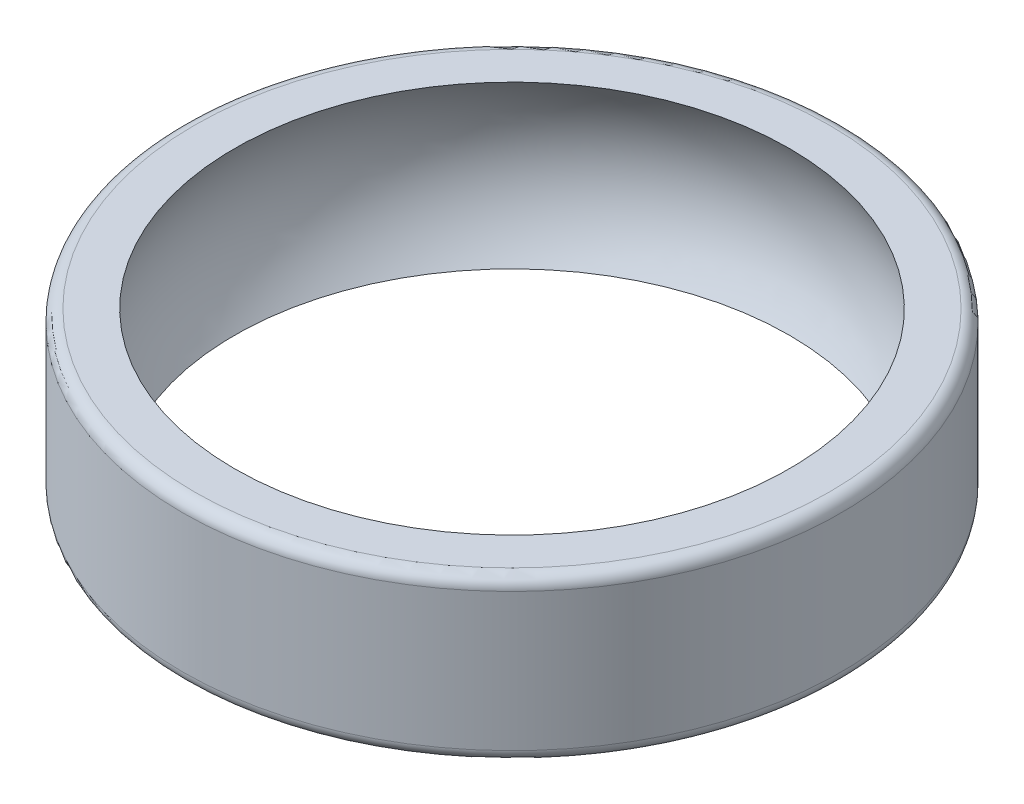
ISO-10303-21;
HEADER;
FILE_DESCRIPTION(('STEP AP214'),'2;1');
FILE_NAME('part.step','',(''),(''),'','','');
FILE_SCHEMA(('AUTOMOTIVE_DESIGN { 1 0 10303 214 1 1 1 1 }'));
ENDSEC;
DATA;
#1=APPLICATION_CONTEXT('core data for automotive mechanical design processes');
#2=APPLICATION_PROTOCOL_DEFINITION('international standard','automotive_design',2000,#1);
#3=PRODUCT_CONTEXT('',#1,'mechanical');
#4=PRODUCT('Part','Part','',(#3));
#5=PRODUCT_RELATED_PRODUCT_CATEGORY('part','',(#4));
#6=PRODUCT_DEFINITION_FORMATION('','',#4);
#7=PRODUCT_DEFINITION_CONTEXT('part definition',#1,'design');
#8=PRODUCT_DEFINITION('design','',#6,#7);
#9=PRODUCT_DEFINITION_SHAPE('','',#8);
#10=(LENGTH_UNIT() NAMED_UNIT(*) SI_UNIT(.MILLI.,.METRE.));
#11=(NAMED_UNIT(*) PLANE_ANGLE_UNIT() SI_UNIT($,.RADIAN.));
#12=(NAMED_UNIT(*) SI_UNIT($,.STERADIAN.) SOLID_ANGLE_UNIT());
#13=UNCERTAINTY_MEASURE_WITH_UNIT(LENGTH_MEASURE(1.E-05),#10,'distance_accuracy_value','');
#14=(GEOMETRIC_REPRESENTATION_CONTEXT(3) GLOBAL_UNCERTAINTY_ASSIGNED_CONTEXT((#13)) GLOBAL_UNIT_ASSIGNED_CONTEXT((#10,
#11,#12)) REPRESENTATION_CONTEXT('',''));
#15=CARTESIAN_POINT('',(0.,0.,0.));
#16=DIRECTION('',(0.,0.,1.));
#17=DIRECTION('',(1.,0.,0.));
#18=AXIS2_PLACEMENT_3D('',#15,#16,#17);
#19=CARTESIAN_POINT('',(0.,27.,0.));
#20=DIRECTION('',(0.,1.,0.));
#21=DIRECTION('',(0.,0.,1.));
#22=AXIS2_PLACEMENT_3D('',#19,#20,#21);
#23=PLANE('',#22);
#24=CARTESIAN_POINT('',(0.,27.,0.));
#25=DIRECTION('',(0.,1.,0.));
#26=DIRECTION('',(0.,0.,1.));
#27=AXIS2_PLACEMENT_3D('',#24,#25,#26);
#28=CIRCLE('',#27,53.);
#29=CARTESIAN_POINT('',(0.,27.,53.));
#30=VERTEX_POINT('',#29);
#31=EDGE_CURVE('E10',#30,#30,#28,.T.);
#32=ORIENTED_EDGE('',*,*,#31,.T.);
#33=EDGE_LOOP('',(#32));
#34=FACE_BOUND('',#33,.T.);
#35=CARTESIAN_POINT('',(0.,27.,0.));
#36=DIRECTION('',(0.,-1.,0.));
#37=DIRECTION('',(0.,0.,-1.));
#38=AXIS2_PLACEMENT_3D('',#35,#36,#37);
#39=CIRCLE('',#38,46.3);
#40=CARTESIAN_POINT('',(0.,27.,-46.3));
#41=VERTEX_POINT('',#40);
#42=EDGE_CURVE('E55',#41,#41,#39,.T.);
#43=ORIENTED_EDGE('',*,*,#42,.T.);
#44=EDGE_LOOP('',(#43));
#45=FACE_BOUND('',#44,.T.);
#46=ADVANCED_FACE('F35',(#34,#45),#23,.T.);
#47=CARTESIAN_POINT('',(0.,0.,0.));
#48=DIRECTION('',(0.,1.,0.));
#49=DIRECTION('',(0.,0.,1.));
#50=AXIS2_PLACEMENT_3D('',#47,#48,#49);
#51=PLANE('',#50);
#52=CARTESIAN_POINT('',(0.,0.,0.));
#53=DIRECTION('',(0.,1.,0.));
#54=DIRECTION('',(0.,0.,1.));
#55=AXIS2_PLACEMENT_3D('',#52,#53,#54);
#56=CIRCLE('',#55,53.);
#57=CARTESIAN_POINT('',(0.,0.,53.));
#58=VERTEX_POINT('',#57);
#59=EDGE_CURVE('E42',#58,#58,#56,.F.);
#60=ORIENTED_EDGE('',*,*,#59,.T.);
#61=EDGE_LOOP('',(#60));
#62=FACE_BOUND('',#61,.T.);
#63=CARTESIAN_POINT('',(0.,0.,0.));
#64=DIRECTION('',(0.,-1.,0.));
#65=DIRECTION('',(0.,0.,-1.));
#66=AXIS2_PLACEMENT_3D('',#63,#64,#65);
#67=CIRCLE('',#66,46.3);
#68=CARTESIAN_POINT('',(0.,0.,-46.3));
#69=VERTEX_POINT('',#68);
#70=EDGE_CURVE('E58',#69,#69,#67,.T.);
#71=ORIENTED_EDGE('',*,*,#70,.F.);
#72=EDGE_LOOP('',(#71));
#73=FACE_BOUND('',#72,.T.);
#74=ADVANCED_FACE('F74',(#62,#73),#51,.F.);
#75=CARTESIAN_POINT('',(0.,27.,0.));
#76=DIRECTION('',(0.,-1.,0.));
#77=DIRECTION('',(0.,0.,-1.));
#78=AXIS2_PLACEMENT_3D('',#75,#76,#77);
#79=CYLINDRICAL_SURFACE('',#78,55.);
#80=CARTESIAN_POINT('',(0.,2.,0.));
#81=DIRECTION('',(0.,1.,0.));
#82=DIRECTION('',(0.,0.,1.));
#83=AXIS2_PLACEMENT_3D('',#80,#81,#82);
#84=CIRCLE('',#83,55.);
#85=CARTESIAN_POINT('',(0.,2.,55.));
#86=VERTEX_POINT('',#85);
#87=EDGE_CURVE('E46',#86,#86,#84,.T.);
#88=ORIENTED_EDGE('',*,*,#87,.T.);
#89=EDGE_LOOP('',(#88));
#90=FACE_BOUND('',#89,.T.);
#91=CARTESIAN_POINT('',(0.,25.,0.));
#92=DIRECTION('',(0.,1.,0.));
#93=DIRECTION('',(0.,0.,1.));
#94=AXIS2_PLACEMENT_3D('',#91,#92,#93);
#95=CIRCLE('',#94,55.);
#96=CARTESIAN_POINT('',(0.,25.,55.));
#97=VERTEX_POINT('',#96);
#98=EDGE_CURVE('E50',#97,#97,#95,.F.);
#99=ORIENTED_EDGE('',*,*,#98,.T.);
#100=EDGE_LOOP('',(#99));
#101=FACE_BOUND('',#100,.T.);
#102=ADVANCED_FACE('F77',(#90,#101),#79,.T.);
#103=CARTESIAN_POINT('',(0.,2.,0.));
#104=DIRECTION('',(0.,1.,0.));
#105=DIRECTION('',(0.,0.,1.));
#106=AXIS2_PLACEMENT_3D('',#103,#104,#105);
#107=TOROIDAL_SURFACE('',#106,53.,2.);
#108=ORIENTED_EDGE('',*,*,#59,.F.);
#109=EDGE_LOOP('',(#108));
#110=FACE_BOUND('',#109,.T.);
#111=ORIENTED_EDGE('',*,*,#87,.F.);
#112=EDGE_LOOP('',(#111));
#113=FACE_BOUND('',#112,.T.);
#114=ADVANCED_FACE('F79',(#110,#113),#107,.T.);
#115=CARTESIAN_POINT('',(0.,25.,0.));
#116=DIRECTION('',(0.,1.,0.));
#117=DIRECTION('',(0.,0.,1.));
#118=AXIS2_PLACEMENT_3D('',#115,#116,#117);
#119=TOROIDAL_SURFACE('',#118,53.,2.);
#120=ORIENTED_EDGE('',*,*,#98,.F.);
#121=EDGE_LOOP('',(#120));
#122=FACE_BOUND('',#121,.T.);
#123=ORIENTED_EDGE('',*,*,#31,.F.);
#124=EDGE_LOOP('',(#123));
#125=FACE_BOUND('',#124,.T.);
#126=ADVANCED_FACE('F37',(#122,#125),#119,.T.);
#127=CARTESIAN_POINT('',(-46.3,27.,0.));
#128=CARTESIAN_POINT('',(-55.6388147415829,13.5,0.));
#129=CARTESIAN_POINT('',(-46.3,0.,0.));
#130=B_SPLINE_CURVE_WITH_KNOTS('',2,(#127,#128,#129),.UNSPECIFIED.,.F.,.F.,(3,3),(0.,1.),.UNSPECIFIED.);
#131=CARTESIAN_POINT('',(0.,0.,0.));
#132=DIRECTION('',(0.,-1.,0.));
#133=AXIS1_PLACEMENT('',#131,#132);
#134=SURFACE_OF_REVOLUTION('',#130,#133);
#135=ORIENTED_EDGE('',*,*,#70,.T.);
#136=EDGE_LOOP('',(#135));
#137=FACE_BOUND('',#136,.T.);
#138=ORIENTED_EDGE('',*,*,#42,.F.);
#139=EDGE_LOOP('',(#138));
#140=FACE_BOUND('',#139,.T.);
#141=ADVANCED_FACE('F68',(#137,#140),#134,.F.);
#142=CLOSED_SHELL('',(#46,#74,#102,#114,#126,#141));
#143=MANIFOLD_SOLID_BREP('B2',#142);
#144=ADVANCED_BREP_SHAPE_REPRESENTATION('',(#18,#143),#14);
#145=SHAPE_DEFINITION_REPRESENTATION(#9,#144);
ENDSEC;
END-ISO-10303-21;
